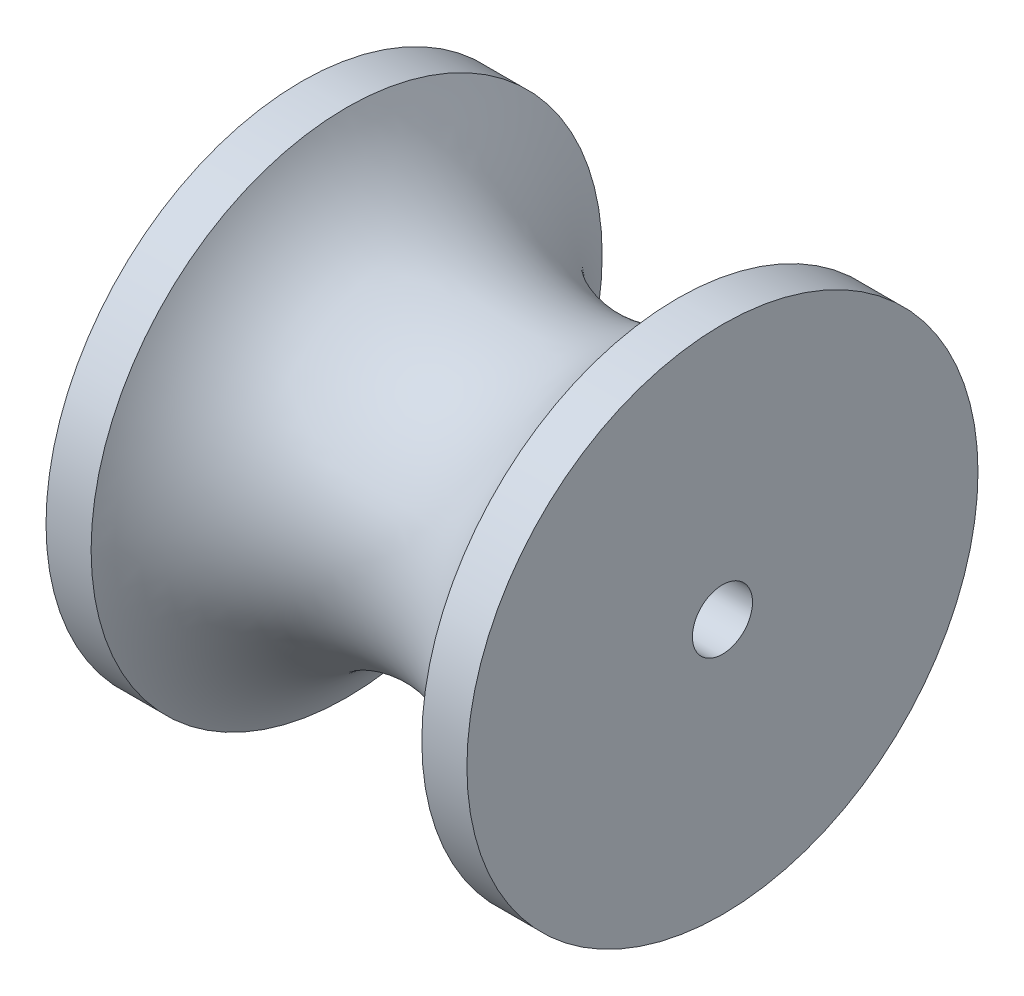
ISO-10303-21;
HEADER;
FILE_DESCRIPTION(('STEP AP214'),'2;1');
FILE_NAME('part.step','',(''),(''),'','','');
FILE_SCHEMA(('AUTOMOTIVE_DESIGN { 1 0 10303 214 1 1 1 1 }'));
ENDSEC;
DATA;
#1=APPLICATION_CONTEXT('core data for automotive mechanical design processes');
#2=APPLICATION_PROTOCOL_DEFINITION('international standard','automotive_design',2000,#1);
#3=PRODUCT_CONTEXT('',#1,'mechanical');
#4=PRODUCT('Part','Part','',(#3));
#5=PRODUCT_RELATED_PRODUCT_CATEGORY('part','',(#4));
#6=PRODUCT_DEFINITION_FORMATION('','',#4);
#7=PRODUCT_DEFINITION_CONTEXT('part definition',#1,'design');
#8=PRODUCT_DEFINITION('design','',#6,#7);
#9=PRODUCT_DEFINITION_SHAPE('','',#8);
#10=(LENGTH_UNIT() NAMED_UNIT(*) SI_UNIT(.MILLI.,.METRE.));
#11=(NAMED_UNIT(*) PLANE_ANGLE_UNIT() SI_UNIT($,.RADIAN.));
#12=(NAMED_UNIT(*) SI_UNIT($,.STERADIAN.) SOLID_ANGLE_UNIT());
#13=UNCERTAINTY_MEASURE_WITH_UNIT(LENGTH_MEASURE(1.E-05),#10,'distance_accuracy_value','');
#14=(GEOMETRIC_REPRESENTATION_CONTEXT(3) GLOBAL_UNCERTAINTY_ASSIGNED_CONTEXT((#13)) GLOBAL_UNIT_ASSIGNED_CONTEXT((#10,
#11,#12)) REPRESENTATION_CONTEXT('',''));
#15=CARTESIAN_POINT('',(0.,0.,0.));
#16=DIRECTION('',(0.,0.,1.));
#17=DIRECTION('',(1.,0.,0.));
#18=AXIS2_PLACEMENT_3D('',#15,#16,#17);
#19=CARTESIAN_POINT('',(250.983966235517,108.054141373024,0.));
#20=DIRECTION('',(1.,0.,0.));
#21=DIRECTION('',(0.,0.,-1.));
#22=AXIS2_PLACEMENT_3D('',#19,#20,#21);
#23=PLANE('',#22);
#24=CARTESIAN_POINT('',(250.983966235517,108.054141373024,0.));
#25=DIRECTION('',(1.,0.,0.));
#26=DIRECTION('',(0.,0.,-1.));
#27=AXIS2_PLACEMENT_3D('',#24,#25,#26);
#28=CIRCLE('',#27,1.);
#29=CARTESIAN_POINT('',(250.983966235517,108.054141373024,-1.));
#30=VERTEX_POINT('',#29);
#31=EDGE_CURVE('E56',#30,#30,#28,.T.);
#32=ORIENTED_EDGE('',*,*,#31,.T.);
#33=EDGE_LOOP('',(#32));
#34=FACE_BOUND('',#33,.T.);
#35=CARTESIAN_POINT('',(250.983966235517,108.054141373024,0.));
#36=DIRECTION('',(-1.,0.,0.));
#37=DIRECTION('',(0.,0.,1.));
#38=AXIS2_PLACEMENT_3D('',#35,#36,#37);
#39=CIRCLE('',#38,8.49999999999999);
#40=CARTESIAN_POINT('',(250.983966235517,108.054141373024,8.49999999999999));
#41=VERTEX_POINT('',#40);
#42=EDGE_CURVE('E51',#41,#41,#39,.T.);
#43=ORIENTED_EDGE('',*,*,#42,.T.);
#44=EDGE_LOOP('',(#43));
#45=FACE_BOUND('',#44,.T.);
#46=ADVANCED_FACE('F37',(#34,#45),#23,.F.);
#47=CARTESIAN_POINT('',(264.983966235517,108.054141373024,0.));
#48=DIRECTION('',(-1.,0.,0.));
#49=DIRECTION('',(0.,0.,1.));
#50=AXIS2_PLACEMENT_3D('',#47,#48,#49);
#51=PLANE('',#50);
#52=CARTESIAN_POINT('',(264.983966235517,108.054141373024,0.));
#53=DIRECTION('',(1.,0.,0.));
#54=DIRECTION('',(0.,0.,-1.));
#55=AXIS2_PLACEMENT_3D('',#52,#53,#54);
#56=CIRCLE('',#55,1.);
#57=CARTESIAN_POINT('',(264.983966235517,108.054141373024,-1.));
#58=VERTEX_POINT('',#57);
#59=EDGE_CURVE('E57',#58,#58,#56,.T.);
#60=ORIENTED_EDGE('',*,*,#59,.F.);
#61=EDGE_LOOP('',(#60));
#62=FACE_BOUND('',#61,.T.);
#63=CARTESIAN_POINT('',(264.983966235517,108.054141373024,0.));
#64=DIRECTION('',(-1.,0.,0.));
#65=DIRECTION('',(0.,0.,1.));
#66=AXIS2_PLACEMENT_3D('',#63,#64,#65);
#67=CIRCLE('',#66,8.49999999999999);
#68=CARTESIAN_POINT('',(264.983966235517,108.054141373024,8.49999999999999));
#69=VERTEX_POINT('',#68);
#70=EDGE_CURVE('E10',#69,#69,#67,.T.);
#71=ORIENTED_EDGE('',*,*,#70,.F.);
#72=EDGE_LOOP('',(#71));
#73=FACE_BOUND('',#72,.T.);
#74=ADVANCED_FACE('F72',(#62,#73),#51,.F.);
#75=CARTESIAN_POINT('',(250.983966235517,108.054141373024,0.));
#76=DIRECTION('',(-1.,0.,0.));
#77=DIRECTION('',(0.,0.,1.));
#78=AXIS2_PLACEMENT_3D('',#75,#76,#77);
#79=CYLINDRICAL_SURFACE('',#78,8.49999999999999);
#80=CARTESIAN_POINT('',(263.483966235517,108.054141373024,0.));
#81=DIRECTION('',(-1.,0.,0.));
#82=DIRECTION('',(0.,0.,1.));
#83=AXIS2_PLACEMENT_3D('',#80,#81,#82);
#84=CIRCLE('',#83,8.49999999999999);
#85=CARTESIAN_POINT('',(263.483966235517,108.054141373024,8.49999999999999));
#86=VERTEX_POINT('',#85);
#87=EDGE_CURVE('E43',#86,#86,#84,.T.);
#88=ORIENTED_EDGE('',*,*,#87,.F.);
#89=EDGE_LOOP('',(#88));
#90=FACE_BOUND('',#89,.T.);
#91=ORIENTED_EDGE('',*,*,#70,.T.);
#92=EDGE_LOOP('',(#91));
#93=FACE_BOUND('',#92,.T.);
#94=ADVANCED_FACE('F75',(#90,#93),#79,.T.);
#95=CARTESIAN_POINT('',(257.983966235517,108.054141373024,0.));
#96=DIRECTION('',(-1.,0.,0.));
#97=DIRECTION('',(0.,0.,1.));
#98=AXIS2_PLACEMENT_3D('',#95,#96,#97);
#99=TOROIDAL_SURFACE('',#98,11.0861916247999,6.07769587263011);
#100=CARTESIAN_POINT('',(252.483966235517,108.054141373024,0.));
#101=DIRECTION('',(-1.,0.,0.));
#102=DIRECTION('',(0.,0.,1.));
#103=AXIS2_PLACEMENT_3D('',#100,#101,#102);
#104=CIRCLE('',#103,8.49999999999999);
#105=CARTESIAN_POINT('',(252.483966235517,108.054141373024,8.49999999999999));
#106=VERTEX_POINT('',#105);
#107=EDGE_CURVE('E47',#106,#106,#104,.T.);
#108=ORIENTED_EDGE('',*,*,#107,.F.);
#109=EDGE_LOOP('',(#108));
#110=FACE_BOUND('',#109,.T.);
#111=ORIENTED_EDGE('',*,*,#87,.T.);
#112=EDGE_LOOP('',(#111));
#113=FACE_BOUND('',#112,.T.);
#114=ADVANCED_FACE('F80',(#110,#113),#99,.F.);
#115=CARTESIAN_POINT('',(250.983966235517,108.054141373024,0.));
#116=DIRECTION('',(-1.,0.,0.));
#117=DIRECTION('',(0.,0.,1.));
#118=AXIS2_PLACEMENT_3D('',#115,#116,#117);
#119=CYLINDRICAL_SURFACE('',#118,8.49999999999999);
#120=ORIENTED_EDGE('',*,*,#42,.F.);
#121=EDGE_LOOP('',(#120));
#122=FACE_BOUND('',#121,.T.);
#123=ORIENTED_EDGE('',*,*,#107,.T.);
#124=EDGE_LOOP('',(#123));
#125=FACE_BOUND('',#124,.T.);
#126=ADVANCED_FACE('F68',(#122,#125),#119,.T.);
#127=CARTESIAN_POINT('',(250.983966235517,108.054141373024,0.));
#128=DIRECTION('',(1.,0.,0.));
#129=DIRECTION('',(0.,0.,-1.));
#130=AXIS2_PLACEMENT_3D('',#127,#128,#129);
#131=CYLINDRICAL_SURFACE('',#130,1.);
#132=CARTESIAN_POINT('',(250.983966235517,108.054141373024,-1.));
#133=CARTESIAN_POINT('',(251.12979956885,108.054141373024,-1.));
#134=CARTESIAN_POINT('',(251.275632902184,108.054141373024,-1.));
#135=CARTESIAN_POINT('',(251.567299568851,108.054141373024,-1.));
#136=CARTESIAN_POINT('',(251.713132902184,108.054141373024,-1.));
#137=CARTESIAN_POINT('',(252.00479956885,108.054141373024,-1.));
#138=CARTESIAN_POINT('',(252.150632902184,108.054141373024,-1.));
#139=CARTESIAN_POINT('',(252.442299568851,108.054141373024,-1.));
#140=CARTESIAN_POINT('',(252.588132902184,108.054141373024,-1.));
#141=CARTESIAN_POINT('',(252.87979956885,108.054141373024,-1.));
#142=CARTESIAN_POINT('',(253.025632902184,108.054141373024,-1.));
#143=CARTESIAN_POINT('',(253.31729956885,108.054141373024,-1.));
#144=CARTESIAN_POINT('',(253.463132902184,108.054141373024,-1.));
#145=CARTESIAN_POINT('',(253.754799568851,108.054141373024,-1.));
#146=CARTESIAN_POINT('',(253.900632902184,108.054141373024,-1.));
#147=CARTESIAN_POINT('',(254.19229956885,108.054141373024,-1.));
#148=CARTESIAN_POINT('',(254.338132902184,108.054141373024,-1.));
#149=CARTESIAN_POINT('',(254.629799568851,108.054141373024,-1.));
#150=CARTESIAN_POINT('',(254.775632902184,108.054141373024,-1.));
#151=CARTESIAN_POINT('',(255.067299568851,108.054141373024,-1.));
#152=CARTESIAN_POINT('',(255.213132902184,108.054141373024,-1.));
#153=CARTESIAN_POINT('',(255.50479956885,108.054141373024,-1.));
#154=CARTESIAN_POINT('',(255.650632902184,108.054141373024,-1.));
#155=CARTESIAN_POINT('',(255.942299568851,108.054141373024,-1.));
#156=CARTESIAN_POINT('',(256.088132902184,108.054141373024,-1.));
#157=CARTESIAN_POINT('',(256.379799568851,108.054141373024,-1.));
#158=CARTESIAN_POINT('',(256.525632902184,108.054141373024,-1.));
#159=CARTESIAN_POINT('',(256.81729956885,108.054141373024,-1.));
#160=CARTESIAN_POINT('',(256.963132902184,108.054141373024,-1.));
#161=CARTESIAN_POINT('',(257.254799568851,108.054141373024,-1.));
#162=CARTESIAN_POINT('',(257.400632902184,108.054141373024,-1.));
#163=CARTESIAN_POINT('',(257.692299568851,108.054141373024,-1.));
#164=CARTESIAN_POINT('',(257.838132902184,108.054141373024,-1.));
#165=CARTESIAN_POINT('',(258.129799568851,108.054141373024,-1.));
#166=CARTESIAN_POINT('',(258.275632902184,108.054141373024,-1.));
#167=CARTESIAN_POINT('',(258.567299568851,108.054141373024,-1.));
#168=CARTESIAN_POINT('',(258.713132902184,108.054141373024,-1.));
#169=CARTESIAN_POINT('',(259.004799568851,108.054141373024,-1.));
#170=CARTESIAN_POINT('',(259.150632902184,108.054141373024,-1.));
#171=CARTESIAN_POINT('',(259.442299568851,108.054141373024,-1.));
#172=CARTESIAN_POINT('',(259.588132902184,108.054141373024,-1.));
#173=CARTESIAN_POINT('',(259.879799568851,108.054141373024,-1.));
#174=CARTESIAN_POINT('',(260.025632902184,108.054141373024,-1.));
#175=CARTESIAN_POINT('',(260.31729956885,108.054141373024,-1.));
#176=CARTESIAN_POINT('',(260.463132902184,108.054141373024,-1.));
#177=CARTESIAN_POINT('',(260.754799568851,108.054141373024,-1.));
#178=CARTESIAN_POINT('',(260.900632902184,108.054141373024,-1.));
#179=CARTESIAN_POINT('',(261.192299568851,108.054141373024,-1.));
#180=CARTESIAN_POINT('',(261.338132902184,108.054141373024,-1.));
#181=CARTESIAN_POINT('',(261.629799568851,108.054141373024,-1.));
#182=CARTESIAN_POINT('',(261.775632902184,108.054141373024,-1.));
#183=CARTESIAN_POINT('',(262.067299568851,108.054141373024,-1.));
#184=CARTESIAN_POINT('',(262.213132902184,108.054141373024,-1.));
#185=CARTESIAN_POINT('',(262.504799568851,108.054141373024,-1.));
#186=CARTESIAN_POINT('',(262.650632902184,108.054141373024,-1.));
#187=CARTESIAN_POINT('',(262.942299568851,108.054141373024,-1.));
#188=CARTESIAN_POINT('',(263.088132902184,108.054141373024,-1.));
#189=CARTESIAN_POINT('',(263.379799568851,108.054141373024,-1.));
#190=CARTESIAN_POINT('',(263.525632902184,108.054141373024,-1.));
#191=CARTESIAN_POINT('',(263.81729956885,108.054141373024,-1.));
#192=CARTESIAN_POINT('',(263.963132902184,108.054141373024,-1.));
#193=CARTESIAN_POINT('',(264.254799568851,108.054141373024,-1.));
#194=CARTESIAN_POINT('',(264.400632902184,108.054141373024,-1.));
#195=CARTESIAN_POINT('',(264.692299568851,108.054141373024,-1.));
#196=CARTESIAN_POINT('',(264.838132902184,108.054141373024,-1.));
#197=CARTESIAN_POINT('',(264.983966235517,108.054141373024,-1.));
#198=B_SPLINE_CURVE_WITH_KNOTS('',3,(#132,#133,#134,#135,#136,#137,#138,#139,#140,#141,#142,
#143,#144,#145,#146,#147,#148,#149,#150,#151,#152,#153,#154,#155,#156,#157,#158,#159,#160,#161,
#162,#163,#164,#165,#166,#167,#168,#169,#170,#171,#172,#173,#174,#175,#176,#177,#178,#179,#180,
#181,#182,#183,#184,#185,#186,#187,#188,#189,#190,#191,#192,#193,#194,#195,#196,#197),
.UNSPECIFIED.,.F.,.F.,(4,2,2,2,2,2,2,2,2,2,2,2,2,2,2,2,2,2,2,2,2,2,2,2,2,2,2,2,2,2,2,2,4),(0.,
0.437500000000035,0.875000000000015,1.31250000000005,1.75000000000003,2.18750000000001,
2.62500000000004,3.06250000000002,3.50000000000006,3.93750000000004,4.37500000000002,
4.81250000000005,5.25000000000003,5.68750000000001,6.12500000000005,6.56250000000003,
7.00000000000006,7.43750000000004,7.87500000000002,8.31250000000006,8.75000000000004,
9.18750000000001,9.62500000000005,10.0625,10.5000000000001,10.9375,11.375,11.8125000000001,
12.25,12.6875,13.1250000000001,13.5625,14.0000000000001),.UNSPECIFIED.);
#199=EDGE_CURVE('BSEAM65',#30,#58,#198,.T.);
#200=ORIENTED_EDGE('',*,*,#31,.F.);
#201=ORIENTED_EDGE('',*,*,#59,.T.);
#202=ORIENTED_EDGE('',*,*,#199,.T.);
#203=ORIENTED_EDGE('',*,*,#199,.F.);
#204=EDGE_LOOP('',(#200,#202,#201,#203));
#205=FACE_BOUND('',#204,.T.);
#206=ADVANCED_FACE('F65',(#205),#131,.F.);
#207=CLOSED_SHELL('',(#46,#74,#94,#114,#126,#206));
#208=MANIFOLD_SOLID_BREP('B2',#207);
#209=ADVANCED_BREP_SHAPE_REPRESENTATION('',(#18,#208),#14);
#210=SHAPE_DEFINITION_REPRESENTATION(#9,#209);
ENDSEC;
END-ISO-10303-21;
